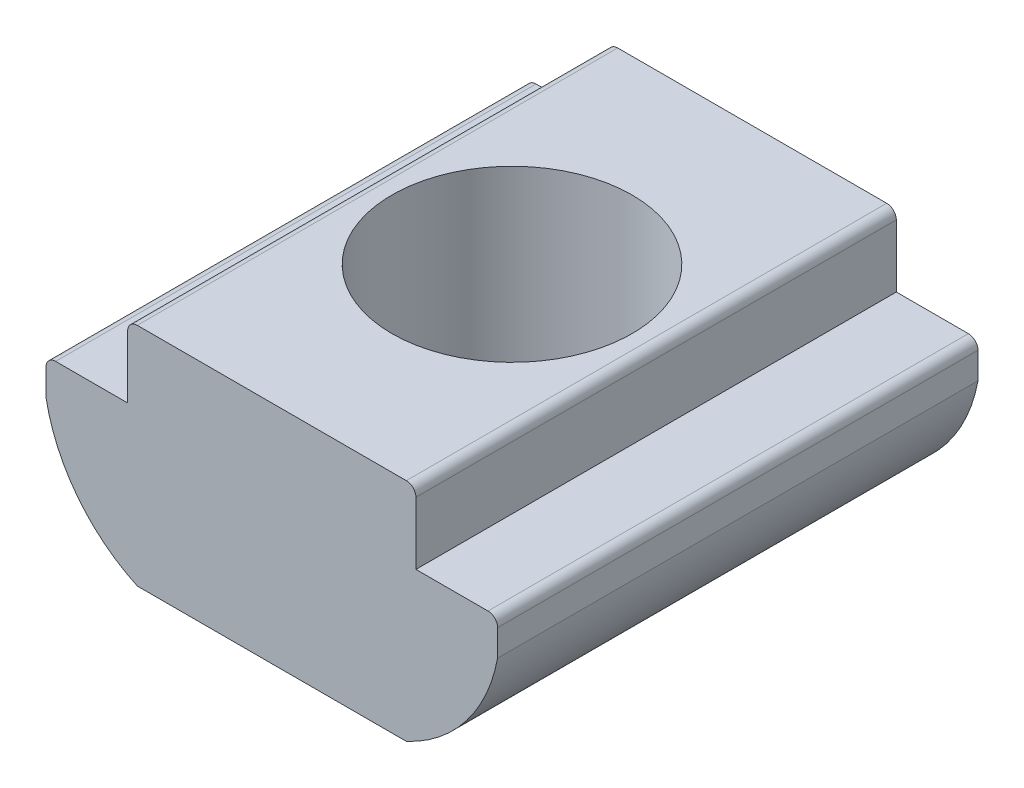
ISO-10303-21;
HEADER;
FILE_DESCRIPTION(('STEP AP214'),'2;1');
FILE_NAME('part.step','',(''),(''),'','','');
FILE_SCHEMA(('AUTOMOTIVE_DESIGN { 1 0 10303 214 1 1 1 1 }'));
ENDSEC;
DATA;
#1=APPLICATION_CONTEXT('core data for automotive mechanical design processes');
#2=APPLICATION_PROTOCOL_DEFINITION('international standard','automotive_design',2000,#1);
#3=PRODUCT_CONTEXT('',#1,'mechanical');
#4=PRODUCT('Part','Part','',(#3));
#5=PRODUCT_RELATED_PRODUCT_CATEGORY('part','',(#4));
#6=PRODUCT_DEFINITION_FORMATION('','',#4);
#7=PRODUCT_DEFINITION_CONTEXT('part definition',#1,'design');
#8=PRODUCT_DEFINITION('design','',#6,#7);
#9=PRODUCT_DEFINITION_SHAPE('','',#8);
#10=(LENGTH_UNIT() NAMED_UNIT(*) SI_UNIT(.MILLI.,.METRE.));
#11=(NAMED_UNIT(*) PLANE_ANGLE_UNIT() SI_UNIT($,.RADIAN.));
#12=(NAMED_UNIT(*) SI_UNIT($,.STERADIAN.) SOLID_ANGLE_UNIT());
#13=UNCERTAINTY_MEASURE_WITH_UNIT(LENGTH_MEASURE(1.E-05),#10,'distance_accuracy_value','');
#14=(GEOMETRIC_REPRESENTATION_CONTEXT(3) GLOBAL_UNCERTAINTY_ASSIGNED_CONTEXT((#13)) GLOBAL_UNIT_ASSIGNED_CONTEXT((#10,
#11,#12)) REPRESENTATION_CONTEXT('',''));
#15=CARTESIAN_POINT('',(0.,0.,0.));
#16=DIRECTION('',(0.,0.,1.));
#17=DIRECTION('',(1.,0.,0.));
#18=AXIS2_PLACEMENT_3D('',#15,#16,#17);
#19=CARTESIAN_POINT('',(-2.79999999999882,4.49999999999909,5.));
#20=DIRECTION('',(0.,0.,-1.));
#21=DIRECTION('',(-1.,0.,0.));
#22=AXIS2_PLACEMENT_3D('',#19,#20,#21);
#23=CYLINDRICAL_SURFACE('',#22,0.200000000000955);
#24=CARTESIAN_POINT('',(-2.79999999999882,4.49999999999909,-5.));
#25=DIRECTION('',(0.,0.,1.));
#26=DIRECTION('',(1.,0.,0.));
#27=AXIS2_PLACEMENT_3D('',#24,#25,#26);
#28=CIRCLE('',#27,0.200000000000955);
#29=CARTESIAN_POINT('',(-2.80000000000018,4.69999999999982,-5.));
#30=VERTEX_POINT('',#29);
#31=CARTESIAN_POINT('',(-3.,4.5,-5.));
#32=VERTEX_POINT('',#31);
#33=EDGE_CURVE('E171',#30,#32,#28,.T.);
#34=ORIENTED_EDGE('',*,*,#33,.T.);
#35=DIRECTION('',(0.,0.,-1.));
#36=VECTOR('',#35,1.);
#37=CARTESIAN_POINT('',(-3.,4.5,5.));
#38=LINE('',#37,#36);
#39=CARTESIAN_POINT('',(-3.,4.5,5.));
#40=VERTEX_POINT('',#39);
#41=EDGE_CURVE('E11',#40,#32,#38,.T.);
#42=ORIENTED_EDGE('',*,*,#41,.F.);
#43=CARTESIAN_POINT('',(-2.79999999999882,4.49999999999909,5.));
#44=DIRECTION('',(0.,0.,1.));
#45=DIRECTION('',(1.,0.,0.));
#46=AXIS2_PLACEMENT_3D('',#43,#44,#45);
#47=CIRCLE('',#46,0.200000000000955);
#48=CARTESIAN_POINT('',(-2.80000000000018,4.69999999999982,5.));
#49=VERTEX_POINT('',#48);
#50=EDGE_CURVE('E198',#49,#40,#47,.T.);
#51=ORIENTED_EDGE('',*,*,#50,.F.);
#52=DIRECTION('',(0.,0.,-1.));
#53=VECTOR('',#52,1.);
#54=CARTESIAN_POINT('',(-2.80000000000018,4.69999999999982,5.));
#55=LINE('',#54,#53);
#56=EDGE_CURVE('E167',#49,#30,#55,.T.);
#57=ORIENTED_EDGE('',*,*,#56,.T.);
#58=EDGE_LOOP('',(#34,#42,#51,#57));
#59=FACE_BOUND('',#58,.T.);
#60=ADVANCED_FACE('F39',(#59),#23,.T.);
#61=CARTESIAN_POINT('',(-3.,4.5,5.));
#62=DIRECTION('',(1.,-3.49947101211426E-13,0.));
#63=DIRECTION('',(3.49947101211426E-13,1.,0.));
#64=AXIS2_PLACEMENT_3D('',#61,#62,#63);
#65=PLANE('',#64);
#66=DIRECTION('',(-3.49947101211426E-13,-1.,0.));
#67=VECTOR('',#66,1.);
#68=CARTESIAN_POINT('',(-3.,4.5,-5.));
#69=LINE('',#68,#67);
#70=CARTESIAN_POINT('',(-3.00000000000046,3.19999999999982,-5.));
#71=VERTEX_POINT('',#70);
#72=EDGE_CURVE('E174',#32,#71,#69,.T.);
#73=ORIENTED_EDGE('',*,*,#72,.T.);
#74=DIRECTION('',(0.,0.,-1.));
#75=VECTOR('',#74,1.);
#76=CARTESIAN_POINT('',(-3.00000000000046,3.19999999999982,5.));
#77=LINE('',#76,#75);
#78=CARTESIAN_POINT('',(-3.00000000000046,3.19999999999982,5.));
#79=VERTEX_POINT('',#78);
#80=EDGE_CURVE('E47',#79,#71,#77,.T.);
#81=ORIENTED_EDGE('',*,*,#80,.F.);
#82=DIRECTION('',(-3.49947101211426E-13,-1.,0.));
#83=VECTOR('',#82,1.);
#84=CARTESIAN_POINT('',(-3.,4.5,5.));
#85=LINE('',#84,#83);
#86=EDGE_CURVE('E116',#40,#79,#85,.T.);
#87=ORIENTED_EDGE('',*,*,#86,.F.);
#88=ORIENTED_EDGE('',*,*,#41,.T.);
#89=EDGE_LOOP('',(#73,#81,#87,#88));
#90=FACE_BOUND('',#89,.T.);
#91=ADVANCED_FACE('F288',(#90),#65,.F.);
#92=CARTESIAN_POINT('',(-4.5,3.19999999999982,5.));
#93=DIRECTION('',(0.,-1.,0.));
#94=DIRECTION('',(0.,0.,-1.));
#95=AXIS2_PLACEMENT_3D('',#92,#93,#94);
#96=PLANE('',#95);
#97=DIRECTION('',(-1.,0.,0.));
#98=VECTOR('',#97,1.);
#99=CARTESIAN_POINT('',(-4.5,3.19999999999982,-5.));
#100=LINE('',#99,#98);
#101=CARTESIAN_POINT('',(-4.5,3.19999999999982,-5.));
#102=VERTEX_POINT('',#101);
#103=EDGE_CURVE('E177',#71,#102,#100,.T.);
#104=ORIENTED_EDGE('',*,*,#103,.T.);
#105=DIRECTION('',(0.,0.,-1.));
#106=VECTOR('',#105,1.);
#107=CARTESIAN_POINT('',(-4.5,3.19999999999982,5.));
#108=LINE('',#107,#106);
#109=CARTESIAN_POINT('',(-4.5,3.19999999999982,5.));
#110=VERTEX_POINT('',#109);
#111=EDGE_CURVE('E223',#110,#102,#108,.T.);
#112=ORIENTED_EDGE('',*,*,#111,.F.);
#113=DIRECTION('',(-1.,0.,0.));
#114=VECTOR('',#113,1.);
#115=CARTESIAN_POINT('',(-4.5,3.19999999999982,5.));
#116=LINE('',#115,#114);
#117=EDGE_CURVE('E231',#79,#110,#116,.T.);
#118=ORIENTED_EDGE('',*,*,#117,.F.);
#119=ORIENTED_EDGE('',*,*,#80,.T.);
#120=EDGE_LOOP('',(#104,#112,#118,#119));
#121=FACE_BOUND('',#120,.T.);
#122=ADVANCED_FACE('F229',(#121),#96,.F.);
#123=CARTESIAN_POINT('',(-4.49999999999909,2.99999999999909,5.));
#124=DIRECTION('',(0.,0.,-1.));
#125=DIRECTION('',(-1.,0.,0.));
#126=AXIS2_PLACEMENT_3D('',#123,#124,#125);
#127=CYLINDRICAL_SURFACE('',#126,0.200000000000727);
#128=CARTESIAN_POINT('',(-4.49999999999909,2.99999999999909,-5.));
#129=DIRECTION('',(0.,0.,1.));
#130=DIRECTION('',(1.,0.,0.));
#131=AXIS2_PLACEMENT_3D('',#128,#129,#130);
#132=CIRCLE('',#131,0.200000000000727);
#133=CARTESIAN_POINT('',(-4.69999999999982,3.,-5.));
#134=VERTEX_POINT('',#133);
#135=EDGE_CURVE('E179',#102,#134,#132,.T.);
#136=ORIENTED_EDGE('',*,*,#135,.T.);
#137=DIRECTION('',(0.,0.,-1.));
#138=VECTOR('',#137,1.);
#139=CARTESIAN_POINT('',(-4.69999999999982,3.,5.));
#140=LINE('',#139,#138);
#141=CARTESIAN_POINT('',(-4.69999999999982,3.,5.));
#142=VERTEX_POINT('',#141);
#143=EDGE_CURVE('E220',#142,#134,#140,.T.);
#144=ORIENTED_EDGE('',*,*,#143,.F.);
#145=CARTESIAN_POINT('',(-4.49999999999909,2.99999999999909,5.));
#146=DIRECTION('',(0.,0.,1.));
#147=DIRECTION('',(1.,0.,0.));
#148=AXIS2_PLACEMENT_3D('',#145,#146,#147);
#149=CIRCLE('',#148,0.200000000000727);
#150=EDGE_CURVE('E249',#110,#142,#149,.T.);
#151=ORIENTED_EDGE('',*,*,#150,.F.);
#152=ORIENTED_EDGE('',*,*,#111,.T.);
#153=EDGE_LOOP('',(#136,#144,#151,#152));
#154=FACE_BOUND('',#153,.T.);
#155=ADVANCED_FACE('F240',(#154),#127,.T.);
#156=CARTESIAN_POINT('',(-4.69999999999982,3.,5.));
#157=DIRECTION('',(1.,8.26359183097306E-13,0.));
#158=DIRECTION('',(-8.26359183097306E-13,1.,0.));
#159=AXIS2_PLACEMENT_3D('',#156,#157,#158);
#160=PLANE('',#159);
#161=DIRECTION('',(8.26359183097306E-13,-1.,0.));
#162=VECTOR('',#161,1.);
#163=CARTESIAN_POINT('',(-4.69999999999982,3.,-5.));
#164=LINE('',#163,#162);
#165=CARTESIAN_POINT('',(-4.69999999999938,2.44999999999709,-5.));
#166=VERTEX_POINT('',#165);
#167=EDGE_CURVE('E181',#134,#166,#164,.T.);
#168=ORIENTED_EDGE('',*,*,#167,.T.);
#169=DIRECTION('',(0.,0.,-1.));
#170=VECTOR('',#169,1.);
#171=CARTESIAN_POINT('',(-4.69999999999938,2.44999999999709,5.));
#172=LINE('',#171,#170);
#173=CARTESIAN_POINT('',(-4.69999999999938,2.44999999999709,5.));
#174=VERTEX_POINT('',#173);
#175=EDGE_CURVE('E217',#174,#166,#172,.T.);
#176=ORIENTED_EDGE('',*,*,#175,.F.);
#177=DIRECTION('',(8.26359183097306E-13,-1.,0.));
#178=VECTOR('',#177,1.);
#179=CARTESIAN_POINT('',(-4.69999999999982,3.,5.));
#180=LINE('',#179,#178);
#181=EDGE_CURVE('E246',#142,#174,#180,.T.);
#182=ORIENTED_EDGE('',*,*,#181,.F.);
#183=ORIENTED_EDGE('',*,*,#143,.T.);
#184=EDGE_LOOP('',(#168,#176,#182,#183));
#185=FACE_BOUND('',#184,.T.);
#186=ADVANCED_FACE('F244',(#185),#160,.F.);
#187=CARTESIAN_POINT('',(-1.37744345733017,3.06494180860091,5.));
#188=DIRECTION('',(0.,0.,-1.));
#189=DIRECTION('',(-1.,0.,0.));
#190=AXIS2_PLACEMENT_3D('',#187,#188,#189);
#191=CYLINDRICAL_SURFACE('',#190,3.37898437510488);
#192=CARTESIAN_POINT('',(-1.37744345733017,3.06494180860091,-5.));
#193=DIRECTION('',(0.,0.,1.));
#194=DIRECTION('',(1.,0.,0.));
#195=AXIS2_PLACEMENT_3D('',#192,#193,#194);
#196=CIRCLE('',#195,3.37898437510488);
#197=CARTESIAN_POINT('',(-2.80000000000018,0.,-5.));
#198=VERTEX_POINT('',#197);
#199=EDGE_CURVE('E183',#166,#198,#196,.T.);
#200=ORIENTED_EDGE('',*,*,#199,.T.);
#201=DIRECTION('',(0.,0.,-1.));
#202=VECTOR('',#201,1.);
#203=CARTESIAN_POINT('',(-2.80000000000018,0.,5.));
#204=LINE('',#203,#202);
#205=CARTESIAN_POINT('',(-2.80000000000018,0.,5.));
#206=VERTEX_POINT('',#205);
#207=EDGE_CURVE('E214',#206,#198,#204,.T.);
#208=ORIENTED_EDGE('',*,*,#207,.F.);
#209=CARTESIAN_POINT('',(-1.37744345733017,3.06494180860091,5.));
#210=DIRECTION('',(0.,0.,1.));
#211=DIRECTION('',(1.,0.,0.));
#212=AXIS2_PLACEMENT_3D('',#209,#210,#211);
#213=CIRCLE('',#212,3.37898437510488);
#214=EDGE_CURVE('E248',#174,#206,#213,.T.);
#215=ORIENTED_EDGE('',*,*,#214,.F.);
#216=ORIENTED_EDGE('',*,*,#175,.T.);
#217=EDGE_LOOP('',(#200,#208,#215,#216));
#218=FACE_BOUND('',#217,.T.);
#219=ADVANCED_FACE('F301',(#218),#191,.T.);
#220=CARTESIAN_POINT('',(-2.80000000000018,0.,5.));
#221=DIRECTION('',(0.,1.,0.));
#222=DIRECTION('',(0.,0.,1.));
#223=AXIS2_PLACEMENT_3D('',#220,#221,#222);
#224=PLANE('',#223);
#225=CARTESIAN_POINT('',(0.,0.,0.));
#226=DIRECTION('',(0.,1.,0.));
#227=DIRECTION('',(0.,0.,1.));
#228=AXIS2_PLACEMENT_3D('',#225,#226,#227);
#229=CIRCLE('',#228,2.5);
#230=CARTESIAN_POINT('',(0.,0.,2.5));
#231=VERTEX_POINT('',#230);
#232=EDGE_CURVE('E175',#231,#231,#229,.T.);
#233=ORIENTED_EDGE('',*,*,#232,.T.);
#234=EDGE_LOOP('',(#233));
#235=FACE_BOUND('',#234,.T.);
#236=DIRECTION('',(1.,0.,0.));
#237=VECTOR('',#236,1.);
#238=CARTESIAN_POINT('',(-2.80000000000018,0.,-5.));
#239=LINE('',#238,#237);
#240=CARTESIAN_POINT('',(2.79999999999976,0.,-5.));
#241=VERTEX_POINT('',#240);
#242=EDGE_CURVE('E185',#198,#241,#239,.T.);
#243=ORIENTED_EDGE('',*,*,#242,.T.);
#244=DIRECTION('',(0.,0.,-1.));
#245=VECTOR('',#244,1.);
#246=CARTESIAN_POINT('',(2.79999999999976,0.,5.));
#247=LINE('',#246,#245);
#248=CARTESIAN_POINT('',(2.79999999999976,0.,5.));
#249=VERTEX_POINT('',#248);
#250=EDGE_CURVE('E211',#249,#241,#247,.T.);
#251=ORIENTED_EDGE('',*,*,#250,.F.);
#252=DIRECTION('',(1.,0.,0.));
#253=VECTOR('',#252,1.);
#254=CARTESIAN_POINT('',(-2.80000000000018,0.,5.));
#255=LINE('',#254,#253);
#256=EDGE_CURVE('E251',#206,#249,#255,.T.);
#257=ORIENTED_EDGE('',*,*,#256,.F.);
#258=ORIENTED_EDGE('',*,*,#207,.T.);
#259=EDGE_LOOP('',(#243,#251,#257,#258));
#260=FACE_BOUND('',#259,.T.);
#261=ADVANCED_FACE('F304',(#235,#260),#224,.F.);
#262=CARTESIAN_POINT('',(1.37744345733017,3.06494180860091,5.));
#263=DIRECTION('',(0.,0.,-1.));
#264=DIRECTION('',(-1.,0.,0.));
#265=AXIS2_PLACEMENT_3D('',#262,#263,#264);
#266=CYLINDRICAL_SURFACE('',#265,3.37898437510478);
#267=CARTESIAN_POINT('',(1.37744345733017,3.06494180860091,-5.));
#268=DIRECTION('',(0.,0.,1.));
#269=DIRECTION('',(1.,0.,0.));
#270=AXIS2_PLACEMENT_3D('',#267,#268,#269);
#271=CIRCLE('',#270,3.37898437510478);
#272=CARTESIAN_POINT('',(4.69999999999936,2.44999999999709,-5.));
#273=VERTEX_POINT('',#272);
#274=EDGE_CURVE('E187',#241,#273,#271,.T.);
#275=ORIENTED_EDGE('',*,*,#274,.T.);
#276=DIRECTION('',(0.,0.,-1.));
#277=VECTOR('',#276,1.);
#278=CARTESIAN_POINT('',(4.69999999999936,2.44999999999709,5.));
#279=LINE('',#278,#277);
#280=CARTESIAN_POINT('',(4.69999999999936,2.44999999999709,5.));
#281=VERTEX_POINT('',#280);
#282=EDGE_CURVE('E208',#281,#273,#279,.T.);
#283=ORIENTED_EDGE('',*,*,#282,.F.);
#284=CARTESIAN_POINT('',(1.37744345733017,3.06494180860091,5.));
#285=DIRECTION('',(0.,0.,1.));
#286=DIRECTION('',(1.,0.,0.));
#287=AXIS2_PLACEMENT_3D('',#284,#285,#286);
#288=CIRCLE('',#287,3.37898437510478);
#289=EDGE_CURVE('E257',#249,#281,#288,.T.);
#290=ORIENTED_EDGE('',*,*,#289,.F.);
#291=ORIENTED_EDGE('',*,*,#250,.T.);
#292=EDGE_LOOP('',(#275,#283,#290,#291));
#293=FACE_BOUND('',#292,.T.);
#294=ADVANCED_FACE('F308',(#293),#266,.T.);
#295=CARTESIAN_POINT('',(4.69999999999982,3.,5.));
#296=DIRECTION('',(-1.,8.26359183097306E-13,0.));
#297=DIRECTION('',(-8.26359183097306E-13,-1.,0.));
#298=AXIS2_PLACEMENT_3D('',#295,#296,#297);
#299=PLANE('',#298);
#300=DIRECTION('',(8.26359183097306E-13,1.,0.));
#301=VECTOR('',#300,1.);
#302=CARTESIAN_POINT('',(4.69999999999982,3.,-5.));
#303=LINE('',#302,#301);
#304=CARTESIAN_POINT('',(4.69999999999982,3.,-5.));
#305=VERTEX_POINT('',#304);
#306=EDGE_CURVE('E189',#273,#305,#303,.T.);
#307=ORIENTED_EDGE('',*,*,#306,.T.);
#308=DIRECTION('',(0.,0.,-1.));
#309=VECTOR('',#308,1.);
#310=CARTESIAN_POINT('',(4.69999999999982,3.,5.));
#311=LINE('',#310,#309);
#312=CARTESIAN_POINT('',(4.69999999999982,3.,5.));
#313=VERTEX_POINT('',#312);
#314=EDGE_CURVE('E205',#313,#305,#311,.T.);
#315=ORIENTED_EDGE('',*,*,#314,.F.);
#316=DIRECTION('',(8.26359183097306E-13,1.,0.));
#317=VECTOR('',#316,1.);
#318=CARTESIAN_POINT('',(4.69999999999982,3.,5.));
#319=LINE('',#318,#317);
#320=EDGE_CURVE('E259',#281,#313,#319,.T.);
#321=ORIENTED_EDGE('',*,*,#320,.F.);
#322=ORIENTED_EDGE('',*,*,#282,.T.);
#323=EDGE_LOOP('',(#307,#315,#321,#322));
#324=FACE_BOUND('',#323,.T.);
#325=ADVANCED_FACE('F312',(#324),#299,.F.);
#326=CARTESIAN_POINT('',(4.49999999999864,2.99999999999864,5.));
#327=DIRECTION('',(0.,0.,-1.));
#328=DIRECTION('',(-1.,0.,0.));
#329=AXIS2_PLACEMENT_3D('',#326,#327,#328);
#330=CYLINDRICAL_SURFACE('',#329,0.200000000001182);
#331=CARTESIAN_POINT('',(4.49999999999864,2.99999999999864,-5.));
#332=DIRECTION('',(0.,0.,1.));
#333=DIRECTION('',(1.,0.,0.));
#334=AXIS2_PLACEMENT_3D('',#331,#332,#333);
#335=CIRCLE('',#334,0.200000000001182);
#336=CARTESIAN_POINT('',(4.5,3.19999999999982,-5.));
#337=VERTEX_POINT('',#336);
#338=EDGE_CURVE('E191',#305,#337,#335,.T.);
#339=ORIENTED_EDGE('',*,*,#338,.T.);
#340=DIRECTION('',(0.,0.,-1.));
#341=VECTOR('',#340,1.);
#342=CARTESIAN_POINT('',(4.5,3.19999999999982,5.));
#343=LINE('',#342,#341);
#344=CARTESIAN_POINT('',(4.5,3.19999999999982,5.));
#345=VERTEX_POINT('',#344);
#346=EDGE_CURVE('E202',#345,#337,#343,.T.);
#347=ORIENTED_EDGE('',*,*,#346,.F.);
#348=CARTESIAN_POINT('',(4.49999999999864,2.99999999999864,5.));
#349=DIRECTION('',(0.,0.,1.));
#350=DIRECTION('',(1.,0.,0.));
#351=AXIS2_PLACEMENT_3D('',#348,#349,#350);
#352=CIRCLE('',#351,0.200000000001182);
#353=EDGE_CURVE('E261',#313,#345,#352,.T.);
#354=ORIENTED_EDGE('',*,*,#353,.F.);
#355=ORIENTED_EDGE('',*,*,#314,.T.);
#356=EDGE_LOOP('',(#339,#347,#354,#355));
#357=FACE_BOUND('',#356,.T.);
#358=ADVANCED_FACE('F267',(#357),#330,.T.);
#359=CARTESIAN_POINT('',(3.,3.19999999999982,5.));
#360=DIRECTION('',(0.,-1.,0.));
#361=DIRECTION('',(0.,0.,-1.));
#362=AXIS2_PLACEMENT_3D('',#359,#360,#361);
#363=PLANE('',#362);
#364=DIRECTION('',(-1.,0.,0.));
#365=VECTOR('',#364,1.);
#366=CARTESIAN_POINT('',(3.,3.19999999999982,-5.));
#367=LINE('',#366,#365);
#368=CARTESIAN_POINT('',(3.,3.19999999999982,-5.));
#369=VERTEX_POINT('',#368);
#370=EDGE_CURVE('E193',#337,#369,#367,.T.);
#371=ORIENTED_EDGE('',*,*,#370,.T.);
#372=DIRECTION('',(0.,0.,-1.));
#373=VECTOR('',#372,1.);
#374=CARTESIAN_POINT('',(3.,3.19999999999982,5.));
#375=LINE('',#374,#373);
#376=CARTESIAN_POINT('',(3.,3.19999999999982,5.));
#377=VERTEX_POINT('',#376);
#378=EDGE_CURVE('E162',#377,#369,#375,.T.);
#379=ORIENTED_EDGE('',*,*,#378,.F.);
#380=DIRECTION('',(-1.,0.,0.));
#381=VECTOR('',#380,1.);
#382=CARTESIAN_POINT('',(3.,3.19999999999982,5.));
#383=LINE('',#382,#381);
#384=EDGE_CURVE('E153',#345,#377,#383,.T.);
#385=ORIENTED_EDGE('',*,*,#384,.F.);
#386=ORIENTED_EDGE('',*,*,#346,.T.);
#387=EDGE_LOOP('',(#371,#379,#385,#386));
#388=FACE_BOUND('',#387,.T.);
#389=ADVANCED_FACE('F271',(#388),#363,.F.);
#390=CARTESIAN_POINT('',(3.,4.5,5.));
#391=DIRECTION('',(-1.,0.,0.));
#392=DIRECTION('',(0.,0.,1.));
#393=AXIS2_PLACEMENT_3D('',#390,#391,#392);
#394=PLANE('',#393);
#395=DIRECTION('',(0.,1.,0.));
#396=VECTOR('',#395,1.);
#397=CARTESIAN_POINT('',(3.,4.5,-5.));
#398=LINE('',#397,#396);
#399=CARTESIAN_POINT('',(3.,4.5,-5.));
#400=VERTEX_POINT('',#399);
#401=EDGE_CURVE('E161',#369,#400,#398,.T.);
#402=ORIENTED_EDGE('',*,*,#401,.T.);
#403=DIRECTION('',(0.,0.,-1.));
#404=VECTOR('',#403,1.);
#405=CARTESIAN_POINT('',(3.,4.5,5.));
#406=LINE('',#405,#404);
#407=CARTESIAN_POINT('',(3.,4.5,5.));
#408=VERTEX_POINT('',#407);
#409=EDGE_CURVE('E158',#408,#400,#406,.T.);
#410=ORIENTED_EDGE('',*,*,#409,.F.);
#411=DIRECTION('',(0.,1.,0.));
#412=VECTOR('',#411,1.);
#413=CARTESIAN_POINT('',(3.,4.5,5.));
#414=LINE('',#413,#412);
#415=EDGE_CURVE('E147',#377,#408,#414,.T.);
#416=ORIENTED_EDGE('',*,*,#415,.F.);
#417=ORIENTED_EDGE('',*,*,#378,.T.);
#418=EDGE_LOOP('',(#402,#410,#416,#417));
#419=FACE_BOUND('',#418,.T.);
#420=ADVANCED_FACE('F159',(#419),#394,.F.);
#421=CARTESIAN_POINT('',(2.79999999999927,4.49999999999909,5.));
#422=DIRECTION('',(0.,0.,-1.));
#423=DIRECTION('',(-1.,0.,0.));
#424=AXIS2_PLACEMENT_3D('',#421,#422,#423);
#425=CYLINDRICAL_SURFACE('',#424,0.200000000000728);
#426=CARTESIAN_POINT('',(2.79999999999927,4.49999999999909,-5.));
#427=DIRECTION('',(0.,0.,1.));
#428=DIRECTION('',(1.,0.,0.));
#429=AXIS2_PLACEMENT_3D('',#426,#427,#428);
#430=CIRCLE('',#429,0.200000000000728);
#431=CARTESIAN_POINT('',(2.80000000000018,4.69999999999982,-5.));
#432=VERTEX_POINT('',#431);
#433=EDGE_CURVE('E102',#400,#432,#430,.T.);
#434=ORIENTED_EDGE('',*,*,#433,.T.);
#435=DIRECTION('',(0.,0.,-1.));
#436=VECTOR('',#435,1.);
#437=CARTESIAN_POINT('',(2.80000000000018,4.69999999999982,5.));
#438=LINE('',#437,#436);
#439=CARTESIAN_POINT('',(2.80000000000018,4.69999999999982,5.));
#440=VERTEX_POINT('',#439);
#441=EDGE_CURVE('E163',#440,#432,#438,.T.);
#442=ORIENTED_EDGE('',*,*,#441,.F.);
#443=CARTESIAN_POINT('',(2.79999999999927,4.49999999999909,5.));
#444=DIRECTION('',(0.,0.,1.));
#445=DIRECTION('',(1.,0.,0.));
#446=AXIS2_PLACEMENT_3D('',#443,#444,#445);
#447=CIRCLE('',#446,0.200000000000728);
#448=EDGE_CURVE('E151',#408,#440,#447,.T.);
#449=ORIENTED_EDGE('',*,*,#448,.F.);
#450=ORIENTED_EDGE('',*,*,#409,.T.);
#451=EDGE_LOOP('',(#434,#442,#449,#450));
#452=FACE_BOUND('',#451,.T.);
#453=ADVANCED_FACE('F165',(#452),#425,.T.);
#454=CARTESIAN_POINT('',(-2.80000000000018,4.69999999999982,5.));
#455=DIRECTION('',(0.,-1.,0.));
#456=DIRECTION('',(0.,0.,-1.));
#457=AXIS2_PLACEMENT_3D('',#454,#455,#456);
#458=PLANE('',#457);
#459=CARTESIAN_POINT('',(0.,4.69999999999982,0.));
#460=DIRECTION('',(0.,1.,0.));
#461=DIRECTION('',(0.,0.,1.));
#462=AXIS2_PLACEMENT_3D('',#459,#460,#461);
#463=CIRCLE('',#462,2.5);
#464=CARTESIAN_POINT('',(0.,4.69999999999982,2.5));
#465=VERTEX_POINT('',#464);
#466=EDGE_CURVE('E373',#465,#465,#463,.T.);
#467=ORIENTED_EDGE('',*,*,#466,.F.);
#468=EDGE_LOOP('',(#467));
#469=FACE_BOUND('',#468,.T.);
#470=DIRECTION('',(-1.,0.,0.));
#471=VECTOR('',#470,1.);
#472=CARTESIAN_POINT('',(-2.80000000000018,4.69999999999982,-5.));
#473=LINE('',#472,#471);
#474=EDGE_CURVE('E108',#432,#30,#473,.T.);
#475=ORIENTED_EDGE('',*,*,#474,.T.);
#476=ORIENTED_EDGE('',*,*,#56,.F.);
#477=DIRECTION('',(-1.,0.,0.));
#478=VECTOR('',#477,1.);
#479=CARTESIAN_POINT('',(-2.80000000000018,4.69999999999982,5.));
#480=LINE('',#479,#478);
#481=EDGE_CURVE('E55',#440,#49,#480,.T.);
#482=ORIENTED_EDGE('',*,*,#481,.F.);
#483=ORIENTED_EDGE('',*,*,#441,.T.);
#484=EDGE_LOOP('',(#475,#476,#482,#483));
#485=FACE_BOUND('',#484,.T.);
#486=ADVANCED_FACE('F275',(#469,#485),#458,.F.);
#487=CARTESIAN_POINT('',(-2.79999999999882,4.49999999999909,5.));
#488=DIRECTION('',(0.,0.,1.));
#489=DIRECTION('',(1.,0.,0.));
#490=AXIS2_PLACEMENT_3D('',#487,#488,#489);
#491=PLANE('',#490);
#492=ORIENTED_EDGE('',*,*,#50,.T.);
#493=ORIENTED_EDGE('',*,*,#86,.T.);
#494=ORIENTED_EDGE('',*,*,#117,.T.);
#495=ORIENTED_EDGE('',*,*,#150,.T.);
#496=ORIENTED_EDGE('',*,*,#181,.T.);
#497=ORIENTED_EDGE('',*,*,#214,.T.);
#498=ORIENTED_EDGE('',*,*,#256,.T.);
#499=ORIENTED_EDGE('',*,*,#289,.T.);
#500=ORIENTED_EDGE('',*,*,#320,.T.);
#501=ORIENTED_EDGE('',*,*,#353,.T.);
#502=ORIENTED_EDGE('',*,*,#384,.T.);
#503=ORIENTED_EDGE('',*,*,#415,.T.);
#504=ORIENTED_EDGE('',*,*,#448,.T.);
#505=ORIENTED_EDGE('',*,*,#481,.T.);
#506=EDGE_LOOP('',(#492,#493,#494,#495,#496,#497,#498,#499,#500,#501,#502,#503,#504,#505));
#507=FACE_BOUND('',#506,.T.);
#508=ADVANCED_FACE('F149',(#507),#491,.T.);
#509=CARTESIAN_POINT('',(-2.79999999999882,4.49999999999909,-5.));
#510=DIRECTION('',(0.,0.,1.));
#511=DIRECTION('',(1.,0.,0.));
#512=AXIS2_PLACEMENT_3D('',#509,#510,#511);
#513=PLANE('',#512);
#514=ORIENTED_EDGE('',*,*,#33,.F.);
#515=ORIENTED_EDGE('',*,*,#474,.F.);
#516=ORIENTED_EDGE('',*,*,#433,.F.);
#517=ORIENTED_EDGE('',*,*,#401,.F.);
#518=ORIENTED_EDGE('',*,*,#370,.F.);
#519=ORIENTED_EDGE('',*,*,#338,.F.);
#520=ORIENTED_EDGE('',*,*,#306,.F.);
#521=ORIENTED_EDGE('',*,*,#274,.F.);
#522=ORIENTED_EDGE('',*,*,#242,.F.);
#523=ORIENTED_EDGE('',*,*,#199,.F.);
#524=ORIENTED_EDGE('',*,*,#167,.F.);
#525=ORIENTED_EDGE('',*,*,#135,.F.);
#526=ORIENTED_EDGE('',*,*,#103,.F.);
#527=ORIENTED_EDGE('',*,*,#72,.F.);
#528=EDGE_LOOP('',(#514,#515,#516,#517,#518,#519,#520,#521,#522,#523,#524,#525,#526,#527));
#529=FACE_BOUND('',#528,.T.);
#530=ADVANCED_FACE('F235',(#529),#513,.F.);
#531=CARTESIAN_POINT('',(0.,4.69999999999982,0.));
#532=DIRECTION('',(0.,1.,0.));
#533=DIRECTION('',(0.,0.,1.));
#534=AXIS2_PLACEMENT_3D('',#531,#532,#533);
#535=CYLINDRICAL_SURFACE('',#534,2.5);
#536=ORIENTED_EDGE('',*,*,#466,.T.);
#537=EDGE_LOOP('',(#536));
#538=FACE_BOUND('',#537,.T.);
#539=ORIENTED_EDGE('',*,*,#232,.F.);
#540=EDGE_LOOP('',(#539));
#541=FACE_BOUND('',#540,.T.);
#542=ADVANCED_FACE('F346',(#538,#541),#535,.F.);
#543=CLOSED_SHELL('',(#60,#91,#122,#155,#186,#219,#261,#294,#325,#358,#389,#420,#453,#486,#508,
#530,#542));
#544=MANIFOLD_SOLID_BREP('B2',#543);
#545=ADVANCED_BREP_SHAPE_REPRESENTATION('',(#18,#544),#14);
#546=SHAPE_DEFINITION_REPRESENTATION(#9,#545);
ENDSEC;
END-ISO-10303-21;
